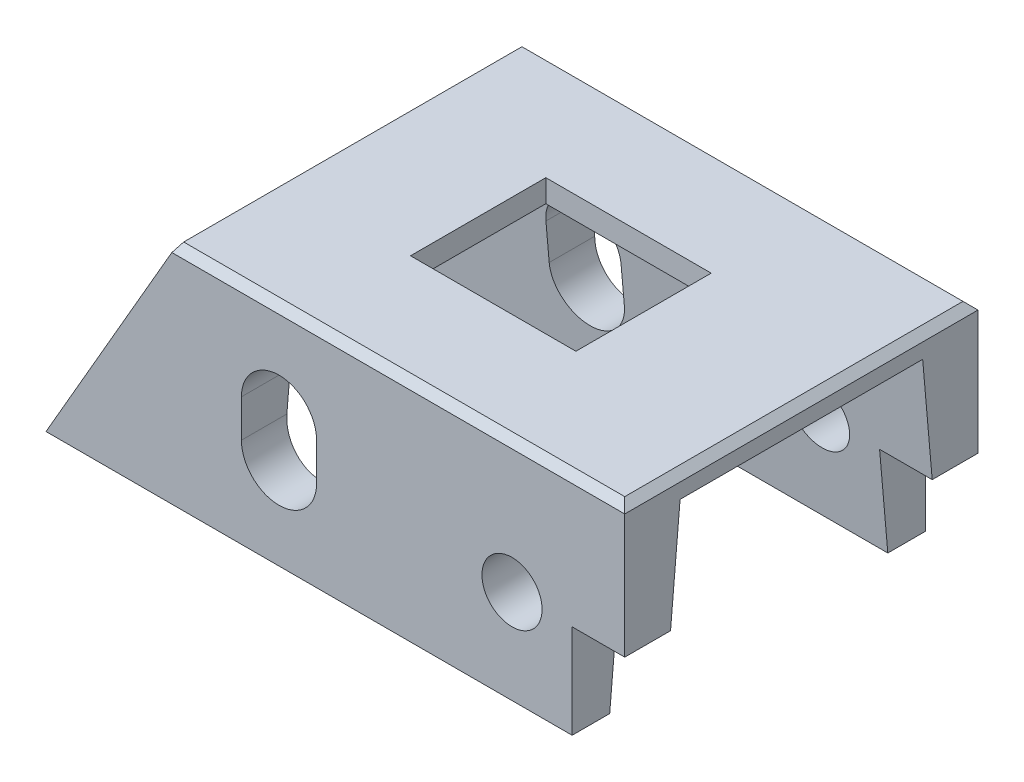
ISO-10303-21;
HEADER;
FILE_DESCRIPTION(('STEP AP214'),'2;1');
FILE_NAME('part.step','',(''),(''),'','','');
FILE_SCHEMA(('AUTOMOTIVE_DESIGN { 1 0 10303 214 1 1 1 1 }'));
ENDSEC;
DATA;
#1=APPLICATION_CONTEXT('core data for automotive mechanical design processes');
#2=APPLICATION_PROTOCOL_DEFINITION('international standard','automotive_design',2000,#1);
#3=PRODUCT_CONTEXT('',#1,'mechanical');
#4=PRODUCT('Part','Part','',(#3));
#5=PRODUCT_RELATED_PRODUCT_CATEGORY('part','',(#4));
#6=PRODUCT_DEFINITION_FORMATION('','',#4);
#7=PRODUCT_DEFINITION_CONTEXT('part definition',#1,'design');
#8=PRODUCT_DEFINITION('design','',#6,#7);
#9=PRODUCT_DEFINITION_SHAPE('','',#8);
#10=(LENGTH_UNIT() NAMED_UNIT(*) SI_UNIT(.MILLI.,.METRE.));
#11=(NAMED_UNIT(*) PLANE_ANGLE_UNIT() SI_UNIT($,.RADIAN.));
#12=(NAMED_UNIT(*) SI_UNIT($,.STERADIAN.) SOLID_ANGLE_UNIT());
#13=UNCERTAINTY_MEASURE_WITH_UNIT(LENGTH_MEASURE(1.E-05),#10,'distance_accuracy_value','');
#14=(GEOMETRIC_REPRESENTATION_CONTEXT(3) GLOBAL_UNCERTAINTY_ASSIGNED_CONTEXT((#13)) GLOBAL_UNIT_ASSIGNED_CONTEXT((#10,
#11,#12)) REPRESENTATION_CONTEXT('',''));
#15=CARTESIAN_POINT('',(0.,0.,0.));
#16=DIRECTION('',(0.,0.,1.));
#17=DIRECTION('',(1.,0.,0.));
#18=AXIS2_PLACEMENT_3D('',#15,#16,#17);
#19=CARTESIAN_POINT('',(-35.,0.,23.5));
#20=DIRECTION('',(0.,1.,0.));
#21=DIRECTION('',(0.,0.,1.));
#22=AXIS2_PLACEMENT_3D('',#19,#20,#21);
#23=PLANE('',#22);
#24=DIRECTION('',(0.,0.,-1.));
#25=VECTOR('',#24,1.);
#26=CARTESIAN_POINT('',(35.,0.,23.5));
#27=LINE('',#26,#25);
#28=CARTESIAN_POINT('',(35.,0.,-18.5));
#29=VERTEX_POINT('',#28);
#30=CARTESIAN_POINT('',(35.,0.,-23.5));
#31=VERTEX_POINT('',#30);
#32=EDGE_CURVE('E388',#29,#31,#27,.T.);
#33=ORIENTED_EDGE('',*,*,#32,.F.);
#34=DIRECTION('',(1.,0.,0.));
#35=VECTOR('',#34,1.);
#36=CARTESIAN_POINT('',(-35.001,0.,-18.5));
#37=LINE('',#36,#35);
#38=CARTESIAN_POINT('',(-35.,0.,-18.5));
#39=VERTEX_POINT('',#38);
#40=EDGE_CURVE('E289',#39,#29,#37,.T.);
#41=ORIENTED_EDGE('',*,*,#40,.F.);
#42=DIRECTION('',(0.,0.,-1.));
#43=VECTOR('',#42,1.);
#44=CARTESIAN_POINT('',(-35.,0.,23.5));
#45=LINE('',#44,#43);
#46=CARTESIAN_POINT('',(-35.,0.,-23.5));
#47=VERTEX_POINT('',#46);
#48=EDGE_CURVE('E392',#39,#47,#45,.T.);
#49=ORIENTED_EDGE('',*,*,#48,.T.);
#50=DIRECTION('',(1.,0.,0.));
#51=VECTOR('',#50,1.);
#52=CARTESIAN_POINT('',(-35.,0.,-23.5));
#53=LINE('',#52,#51);
#54=EDGE_CURVE('E371',#47,#31,#53,.T.);
#55=ORIENTED_EDGE('',*,*,#54,.T.);
#56=EDGE_LOOP('',(#33,#41,#49,#55));
#57=FACE_BOUND('',#56,.T.);
#58=ADVANCED_FACE('F32',(#57),#23,.F.);
#59=CARTESIAN_POINT('',(35.,0.,23.5));
#60=DIRECTION('',(-1.,0.,0.));
#61=DIRECTION('',(0.,0.,1.));
#62=AXIS2_PLACEMENT_3D('',#59,#60,#61);
#63=PLANE('',#62);
#64=DIRECTION('',(0.,0.,-1.));
#65=VECTOR('',#64,1.);
#66=CARTESIAN_POINT('',(35.,12.5,23.5));
#67=LINE('',#66,#65);
#68=CARTESIAN_POINT('',(35.,12.5,-17.4063917059259));
#69=VERTEX_POINT('',#68);
#70=CARTESIAN_POINT('',(35.,12.5,-23.5));
#71=VERTEX_POINT('',#70);
#72=EDGE_CURVE('E384',#69,#71,#67,.T.);
#73=ORIENTED_EDGE('',*,*,#72,.F.);
#74=DIRECTION('',(0.,0.996194698091745,0.0871557427476614));
#75=VECTOR('',#74,1.);
#76=CARTESIAN_POINT('',(35.,0.,-18.5));
#77=LINE('',#76,#75);
#78=EDGE_CURVE('E271',#29,#69,#77,.T.);
#79=ORIENTED_EDGE('',*,*,#78,.F.);
#80=ORIENTED_EDGE('',*,*,#32,.T.);
#81=DIRECTION('',(0.,1.,0.));
#82=VECTOR('',#81,1.);
#83=CARTESIAN_POINT('',(35.,0.,-23.5));
#84=LINE('',#83,#82);
#85=EDGE_CURVE('E374',#31,#71,#84,.T.);
#86=ORIENTED_EDGE('',*,*,#85,.T.);
#87=EDGE_LOOP('',(#73,#79,#80,#86));
#88=FACE_BOUND('',#87,.T.);
#89=ADVANCED_FACE('F479',(#88),#63,.F.);
#90=CARTESIAN_POINT('',(35.,12.5,23.5));
#91=DIRECTION('',(0.,1.,0.));
#92=DIRECTION('',(0.,0.,1.));
#93=AXIS2_PLACEMENT_3D('',#90,#91,#92);
#94=PLANE('',#93);
#95=DIRECTION('',(0.,0.,-1.));
#96=VECTOR('',#95,1.);
#97=CARTESIAN_POINT('',(42.,12.5,23.5));
#98=LINE('',#97,#96);
#99=CARTESIAN_POINT('',(42.,12.5,-17.4063917059259));
#100=VERTEX_POINT('',#99);
#101=CARTESIAN_POINT('',(42.,12.5,-23.5));
#102=VERTEX_POINT('',#101);
#103=EDGE_CURVE('E369',#100,#102,#98,.T.);
#104=ORIENTED_EDGE('',*,*,#103,.F.);
#105=DIRECTION('',(1.,0.,0.));
#106=VECTOR('',#105,1.);
#107=CARTESIAN_POINT('',(-35.001,12.5,-17.4063917059259));
#108=LINE('',#107,#106);
#109=EDGE_CURVE('E253',#69,#100,#108,.T.);
#110=ORIENTED_EDGE('',*,*,#109,.F.);
#111=ORIENTED_EDGE('',*,*,#72,.T.);
#112=DIRECTION('',(1.,0.,0.));
#113=VECTOR('',#112,1.);
#114=CARTESIAN_POINT('',(35.,12.5,-23.5));
#115=LINE('',#114,#113);
#116=EDGE_CURVE('E377',#71,#102,#115,.T.);
#117=ORIENTED_EDGE('',*,*,#116,.T.);
#118=EDGE_LOOP('',(#104,#110,#111,#117));
#119=FACE_BOUND('',#118,.T.);
#120=ADVANCED_FACE('F484',(#119),#94,.F.);
#121=CARTESIAN_POINT('',(-4.,12.,23.5));
#122=DIRECTION('',(0.,0.,-1.));
#123=DIRECTION('',(-1.,0.,0.));
#124=AXIS2_PLACEMENT_3D('',#121,#122,#123);
#125=CYLINDRICAL_SURFACE('',#124,5.);
#126=CARTESIAN_POINT('',(-4.,12.,-17.4501360376889));
#127=DIRECTION('',(0.,0.0871557427476614,-0.996194698091745));
#128=DIRECTION('',(0.,-0.996194698091745,-0.0871557427476614));
#129=AXIS2_PLACEMENT_3D('',#126,#127,#128);
#130=ELLIPSE('',#129,5.01909918771674,5.);
#131=CARTESIAN_POINT('',(-9.00000000000001,12.,-17.4501360376889));
#132=VERTEX_POINT('',#131);
#133=CARTESIAN_POINT('',(0.999999999999996,12.,-17.4501360376889));
#134=VERTEX_POINT('',#133);
#135=EDGE_CURVE('E268',#132,#134,#130,.F.);
#136=ORIENTED_EDGE('',*,*,#135,.T.);
#137=DIRECTION('',(0.,0.,-1.));
#138=VECTOR('',#137,1.);
#139=CARTESIAN_POINT('',(0.999999999999997,12.,23.5));
#140=LINE('',#139,#138);
#141=CARTESIAN_POINT('',(0.999999999999997,12.,-23.5));
#142=VERTEX_POINT('',#141);
#143=EDGE_CURVE('E353',#134,#142,#140,.T.);
#144=ORIENTED_EDGE('',*,*,#143,.T.);
#145=CARTESIAN_POINT('',(-4.,12.,-23.5));
#146=DIRECTION('',(0.,0.,1.));
#147=DIRECTION('',(1.,0.,0.));
#148=AXIS2_PLACEMENT_3D('',#145,#146,#147);
#149=CIRCLE('',#148,5.);
#150=CARTESIAN_POINT('',(-9.00000000000001,12.,-23.5));
#151=VERTEX_POINT('',#150);
#152=EDGE_CURVE('E318',#151,#142,#149,.T.);
#153=ORIENTED_EDGE('',*,*,#152,.F.);
#154=DIRECTION('',(0.,0.,-1.));
#155=VECTOR('',#154,1.);
#156=CARTESIAN_POINT('',(-9.00000000000001,12.,23.5));
#157=LINE('',#156,#155);
#158=EDGE_CURVE('E331',#132,#151,#157,.T.);
#159=ORIENTED_EDGE('',*,*,#158,.F.);
#160=EDGE_LOOP('',(#136,#144,#153,#159));
#161=FACE_BOUND('',#160,.T.);
#162=ADVANCED_FACE('F664',(#161),#125,.F.);
#163=CARTESIAN_POINT('',(0.999999999999997,12.,23.5));
#164=DIRECTION('',(-1.,0.,0.));
#165=DIRECTION('',(0.,0.,1.));
#166=AXIS2_PLACEMENT_3D('',#163,#164,#165);
#167=PLANE('',#166);
#168=DIRECTION('',(0.,0.996194698091745,0.0871557427476614));
#169=VECTOR('',#168,1.);
#170=CARTESIAN_POINT('',(0.999999999999994,0.,-18.5));
#171=LINE('',#170,#169);
#172=CARTESIAN_POINT('',(0.999999999999997,17.,-17.0126927200592));
#173=VERTEX_POINT('',#172);
#174=EDGE_CURVE('E265',#134,#173,#171,.T.);
#175=ORIENTED_EDGE('',*,*,#174,.T.);
#176=DIRECTION('',(0.,0.,-1.));
#177=VECTOR('',#176,1.);
#178=CARTESIAN_POINT('',(0.999999999999997,17.,23.5));
#179=LINE('',#178,#177);
#180=CARTESIAN_POINT('',(0.999999999999997,17.,-23.5));
#181=VERTEX_POINT('',#180);
#182=EDGE_CURVE('E349',#173,#181,#179,.T.);
#183=ORIENTED_EDGE('',*,*,#182,.T.);
#184=DIRECTION('',(0.,1.,0.));
#185=VECTOR('',#184,1.);
#186=CARTESIAN_POINT('',(0.999999999999997,12.,-23.5));
#187=LINE('',#186,#185);
#188=EDGE_CURVE('E334',#142,#181,#187,.T.);
#189=ORIENTED_EDGE('',*,*,#188,.F.);
#190=ORIENTED_EDGE('',*,*,#143,.F.);
#191=EDGE_LOOP('',(#175,#183,#189,#190));
#192=FACE_BOUND('',#191,.T.);
#193=ADVANCED_FACE('F656',(#192),#167,.T.);
#194=CARTESIAN_POINT('',(-4.,17.,23.5));
#195=DIRECTION('',(0.,0.,-1.));
#196=DIRECTION('',(-1.,0.,0.));
#197=AXIS2_PLACEMENT_3D('',#194,#195,#196);
#198=CYLINDRICAL_SURFACE('',#197,5.);
#199=CARTESIAN_POINT('',(-4.,17.,-17.0126927200592));
#200=DIRECTION('',(0.,0.0871557427476614,-0.996194698091745));
#201=DIRECTION('',(0.,-0.996194698091745,-0.0871557427476614));
#202=AXIS2_PLACEMENT_3D('',#199,#200,#201);
#203=ELLIPSE('',#202,5.01909918771674,5.);
#204=CARTESIAN_POINT('',(-9.00000000000001,17.,-17.0126927200592));
#205=VERTEX_POINT('',#204);
#206=EDGE_CURVE('E262',#173,#205,#203,.F.);
#207=ORIENTED_EDGE('',*,*,#206,.T.);
#208=DIRECTION('',(0.,0.,-1.));
#209=VECTOR('',#208,1.);
#210=CARTESIAN_POINT('',(-9.00000000000001,17.,23.5));
#211=LINE('',#210,#209);
#212=CARTESIAN_POINT('',(-9.00000000000001,17.,-23.5));
#213=VERTEX_POINT('',#212);
#214=EDGE_CURVE('E345',#205,#213,#211,.T.);
#215=ORIENTED_EDGE('',*,*,#214,.T.);
#216=CARTESIAN_POINT('',(-4.,17.,-23.5));
#217=DIRECTION('',(0.,0.,1.));
#218=DIRECTION('',(1.,0.,0.));
#219=AXIS2_PLACEMENT_3D('',#216,#217,#218);
#220=CIRCLE('',#219,5.);
#221=EDGE_CURVE('E337',#181,#213,#220,.T.);
#222=ORIENTED_EDGE('',*,*,#221,.F.);
#223=ORIENTED_EDGE('',*,*,#182,.F.);
#224=EDGE_LOOP('',(#207,#215,#222,#223));
#225=FACE_BOUND('',#224,.T.);
#226=ADVANCED_FACE('F646',(#225),#198,.F.);
#227=CARTESIAN_POINT('',(-9.00000000000001,12.,23.5));
#228=DIRECTION('',(1.,0.,0.));
#229=DIRECTION('',(0.,0.,-1.));
#230=AXIS2_PLACEMENT_3D('',#227,#228,#229);
#231=PLANE('',#230);
#232=DIRECTION('',(0.,-0.996194698091745,-0.0871557427476614));
#233=VECTOR('',#232,1.);
#234=CARTESIAN_POINT('',(-9.00000000000001,0.,-18.5));
#235=LINE('',#234,#233);
#236=EDGE_CURVE('E259',#205,#132,#235,.T.);
#237=ORIENTED_EDGE('',*,*,#236,.T.);
#238=ORIENTED_EDGE('',*,*,#158,.T.);
#239=DIRECTION('',(0.,-1.,0.));
#240=VECTOR('',#239,1.);
#241=CARTESIAN_POINT('',(-9.00000000000001,12.,-23.5));
#242=LINE('',#241,#240);
#243=EDGE_CURVE('E324',#213,#151,#242,.T.);
#244=ORIENTED_EDGE('',*,*,#243,.F.);
#245=ORIENTED_EDGE('',*,*,#214,.F.);
#246=EDGE_LOOP('',(#237,#238,#244,#245));
#247=FACE_BOUND('',#246,.T.);
#248=ADVANCED_FACE('F635',(#247),#231,.T.);
#249=CARTESIAN_POINT('',(27.,12.5,23.5));
#250=DIRECTION('',(0.,0.,-1.));
#251=DIRECTION('',(-1.,0.,0.));
#252=AXIS2_PLACEMENT_3D('',#249,#250,#251);
#253=CYLINDRICAL_SURFACE('',#252,4.);
#254=CARTESIAN_POINT('',(27.,12.5,-17.4063917059259));
#255=DIRECTION('',(0.,0.0871557427476614,-0.996194698091745));
#256=DIRECTION('',(0.,-0.996194698091745,-0.0871557427476614));
#257=AXIS2_PLACEMENT_3D('',#254,#255,#256);
#258=ELLIPSE('',#257,4.01527935017339,4.);
#259=CARTESIAN_POINT('',(27.,8.5,-17.7563463600296));
#260=VERTEX_POINT('',#259);
#261=EDGE_CURVE('E256',#260,#260,#258,.F.);
#262=ORIENTED_EDGE('',*,*,#261,.T.);
#263=EDGE_LOOP('',(#262));
#264=FACE_BOUND('',#263,.T.);
#265=CARTESIAN_POINT('',(27.,12.5,-23.5));
#266=DIRECTION('',(0.,0.,1.));
#267=DIRECTION('',(1.,0.,0.));
#268=AXIS2_PLACEMENT_3D('',#265,#266,#267);
#269=CIRCLE('',#268,4.);
#270=CARTESIAN_POINT('',(31.,12.5,-23.5));
#271=VERTEX_POINT('',#270);
#272=EDGE_CURVE('E314',#271,#271,#269,.T.);
#273=ORIENTED_EDGE('',*,*,#272,.F.);
#274=EDGE_LOOP('',(#273));
#275=FACE_BOUND('',#274,.T.);
#276=ADVANCED_FACE('F554',(#264,#275),#253,.F.);
#277=CARTESIAN_POINT('',(0.,0.,23.5));
#278=DIRECTION('',(0.,0.,-1.));
#279=DIRECTION('',(-1.,0.,0.));
#280=AXIS2_PLACEMENT_3D('',#277,#278,#279);
#281=PLANE('',#280);
#282=DIRECTION('',(0.,1.,0.));
#283=VECTOR('',#282,1.);
#284=CARTESIAN_POINT('',(42.,12.5,23.5));
#285=LINE('',#284,#283);
#286=CARTESIAN_POINT('',(42.,12.5,23.5));
#287=VERTEX_POINT('',#286);
#288=CARTESIAN_POINT('',(42.,29.,23.5));
#289=VERTEX_POINT('',#288);
#290=EDGE_CURVE('E367',#287,#289,#285,.T.);
#291=ORIENTED_EDGE('',*,*,#290,.T.);
#292=DIRECTION('',(-1.,0.,0.));
#293=VECTOR('',#292,1.);
#294=CARTESIAN_POINT('',(0.,29.,23.5));
#295=LINE('',#294,#293);
#296=CARTESIAN_POINT('',(-18.2568421935011,29.,23.5));
#297=VERTEX_POINT('',#296);
#298=EDGE_CURVE('E11',#289,#297,#295,.T.);
#299=ORIENTED_EDGE('',*,*,#298,.T.);
#300=DIRECTION('',(-0.499999999999995,-0.866025403784442,0.));
#301=VECTOR('',#300,1.);
#302=CARTESIAN_POINT('',(-17.6794919243115,30.,23.5));
#303=LINE('',#302,#301);
#304=CARTESIAN_POINT('',(-35.,0.,23.5));
#305=VERTEX_POINT('',#304);
#306=EDGE_CURVE('E358',#297,#305,#303,.T.);
#307=ORIENTED_EDGE('',*,*,#306,.T.);
#308=DIRECTION('',(1.,0.,0.));
#309=VECTOR('',#308,1.);
#310=CARTESIAN_POINT('',(-35.,0.,23.5));
#311=LINE('',#310,#309);
#312=CARTESIAN_POINT('',(35.,0.,23.5));
#313=VERTEX_POINT('',#312);
#314=EDGE_CURVE('E360',#305,#313,#311,.T.);
#315=ORIENTED_EDGE('',*,*,#314,.T.);
#316=DIRECTION('',(0.,1.,0.));
#317=VECTOR('',#316,1.);
#318=CARTESIAN_POINT('',(35.,0.,23.5));
#319=LINE('',#318,#317);
#320=CARTESIAN_POINT('',(35.,12.5,23.5));
#321=VERTEX_POINT('',#320);
#322=EDGE_CURVE('E363',#313,#321,#319,.T.);
#323=ORIENTED_EDGE('',*,*,#322,.T.);
#324=DIRECTION('',(1.,0.,0.));
#325=VECTOR('',#324,1.);
#326=CARTESIAN_POINT('',(35.,12.5,23.5));
#327=LINE('',#326,#325);
#328=EDGE_CURVE('E365',#321,#287,#327,.T.);
#329=ORIENTED_EDGE('',*,*,#328,.T.);
#330=EDGE_LOOP('',(#291,#299,#307,#315,#323,#329));
#331=FACE_BOUND('',#330,.T.);
#332=CARTESIAN_POINT('',(-4.,12.,23.5));
#333=DIRECTION('',(0.,0.,1.));
#334=DIRECTION('',(1.,0.,0.));
#335=AXIS2_PLACEMENT_3D('',#332,#333,#334);
#336=CIRCLE('',#335,5.);
#337=CARTESIAN_POINT('',(-9.00000000000001,12.,23.5));
#338=VERTEX_POINT('',#337);
#339=CARTESIAN_POINT('',(0.999999999999997,12.,23.5));
#340=VERTEX_POINT('',#339);
#341=EDGE_CURVE('E321',#338,#340,#336,.T.);
#342=ORIENTED_EDGE('',*,*,#341,.F.);
#343=DIRECTION('',(0.,-1.,0.));
#344=VECTOR('',#343,1.);
#345=CARTESIAN_POINT('',(-9.00000000000001,12.,23.5));
#346=LINE('',#345,#344);
#347=CARTESIAN_POINT('',(-9.00000000000001,17.,23.5));
#348=VERTEX_POINT('',#347);
#349=EDGE_CURVE('E329',#348,#338,#346,.T.);
#350=ORIENTED_EDGE('',*,*,#349,.F.);
#351=CARTESIAN_POINT('',(-4.,17.,23.5));
#352=DIRECTION('',(0.,0.,1.));
#353=DIRECTION('',(1.,0.,0.));
#354=AXIS2_PLACEMENT_3D('',#351,#352,#353);
#355=CIRCLE('',#354,5.);
#356=CARTESIAN_POINT('',(0.999999999999997,17.,23.5));
#357=VERTEX_POINT('',#356);
#358=EDGE_CURVE('E326',#357,#348,#355,.T.);
#359=ORIENTED_EDGE('',*,*,#358,.F.);
#360=DIRECTION('',(0.,1.,0.));
#361=VECTOR('',#360,1.);
#362=CARTESIAN_POINT('',(0.999999999999997,12.,23.5));
#363=LINE('',#362,#361);
#364=EDGE_CURVE('E323',#340,#357,#363,.T.);
#365=ORIENTED_EDGE('',*,*,#364,.F.);
#366=EDGE_LOOP('',(#342,#350,#359,#365));
#367=FACE_BOUND('',#366,.T.);
#368=CARTESIAN_POINT('',(27.,12.5,23.5));
#369=DIRECTION('',(0.,0.,1.));
#370=DIRECTION('',(1.,0.,0.));
#371=AXIS2_PLACEMENT_3D('',#368,#369,#370);
#372=CIRCLE('',#371,4.);
#373=CARTESIAN_POINT('',(31.,12.5,23.5));
#374=VERTEX_POINT('',#373);
#375=EDGE_CURVE('E315',#374,#374,#372,.T.);
#376=ORIENTED_EDGE('',*,*,#375,.F.);
#377=EDGE_LOOP('',(#376));
#378=FACE_BOUND('',#377,.T.);
#379=ADVANCED_FACE('F466',(#331,#367,#378),#281,.F.);
#380=CARTESIAN_POINT('',(0.,0.,-23.5));
#381=DIRECTION('',(0.,0.,-1.));
#382=DIRECTION('',(-1.,0.,0.));
#383=AXIS2_PLACEMENT_3D('',#380,#381,#382);
#384=PLANE('',#383);
#385=ORIENTED_EDGE('',*,*,#243,.T.);
#386=ORIENTED_EDGE('',*,*,#152,.T.);
#387=ORIENTED_EDGE('',*,*,#188,.T.);
#388=ORIENTED_EDGE('',*,*,#221,.T.);
#389=EDGE_LOOP('',(#385,#386,#387,#388));
#390=FACE_BOUND('',#389,.T.);
#391=DIRECTION('',(-0.499999999999995,-0.866025403784442,0.));
#392=VECTOR('',#391,1.);
#393=CARTESIAN_POINT('',(-17.6794919243115,30.,-23.5));
#394=LINE('',#393,#392);
#395=CARTESIAN_POINT('',(-18.2568421935011,29.,-23.5));
#396=VERTEX_POINT('',#395);
#397=EDGE_CURVE('E357',#396,#47,#394,.T.);
#398=ORIENTED_EDGE('',*,*,#397,.F.);
#399=DIRECTION('',(1.,0.,0.));
#400=VECTOR('',#399,1.);
#401=CARTESIAN_POINT('',(42.,29.,-23.5));
#402=LINE('',#401,#400);
#403=CARTESIAN_POINT('',(42.,29.,-23.5));
#404=VERTEX_POINT('',#403);
#405=EDGE_CURVE('E56',#396,#404,#402,.T.);
#406=ORIENTED_EDGE('',*,*,#405,.T.);
#407=DIRECTION('',(0.,1.,0.));
#408=VECTOR('',#407,1.);
#409=CARTESIAN_POINT('',(42.,12.5,-23.5));
#410=LINE('',#409,#408);
#411=EDGE_CURVE('E361',#102,#404,#410,.T.);
#412=ORIENTED_EDGE('',*,*,#411,.F.);
#413=ORIENTED_EDGE('',*,*,#116,.F.);
#414=ORIENTED_EDGE('',*,*,#85,.F.);
#415=ORIENTED_EDGE('',*,*,#54,.F.);
#416=EDGE_LOOP('',(#398,#406,#412,#413,#414,#415));
#417=FACE_BOUND('',#416,.T.);
#418=ORIENTED_EDGE('',*,*,#272,.T.);
#419=EDGE_LOOP('',(#418));
#420=FACE_BOUND('',#419,.T.);
#421=ADVANCED_FACE('F431',(#390,#417,#420),#384,.T.);
#422=CARTESIAN_POINT('',(42.,30.,23.5));
#423=DIRECTION('',(0.,-1.,0.));
#424=DIRECTION('',(1.,0.,0.));
#425=AXIS2_PLACEMENT_3D('',#422,#423,#424);
#426=PLANE('',#425);
#427=DIRECTION('',(-1.,0.,0.));
#428=VECTOR('',#427,1.);
#429=CARTESIAN_POINT('',(-1.00000000000001,30.,-9.));
#430=LINE('',#429,#428);
#431=CARTESIAN_POINT('',(21.,30.,-9.00000000000001));
#432=VERTEX_POINT('',#431);
#433=CARTESIAN_POINT('',(-1.00000000000001,30.,-9.));
#434=VERTEX_POINT('',#433);
#435=EDGE_CURVE('E236',#432,#434,#430,.T.);
#436=ORIENTED_EDGE('',*,*,#435,.F.);
#437=DIRECTION('',(0.,0.,-1.));
#438=VECTOR('',#437,1.);
#439=CARTESIAN_POINT('',(21.,30.,9.));
#440=LINE('',#439,#438);
#441=CARTESIAN_POINT('',(21.,30.,9.));
#442=VERTEX_POINT('',#441);
#443=EDGE_CURVE('E215',#442,#432,#440,.T.);
#444=ORIENTED_EDGE('',*,*,#443,.F.);
#445=DIRECTION('',(1.,0.,0.));
#446=VECTOR('',#445,1.);
#447=CARTESIAN_POINT('',(-1.,30.,9.00000000000001));
#448=LINE('',#447,#446);
#449=CARTESIAN_POINT('',(-1.,30.,9.00000000000001));
#450=VERTEX_POINT('',#449);
#451=EDGE_CURVE('E220',#450,#442,#448,.T.);
#452=ORIENTED_EDGE('',*,*,#451,.F.);
#453=DIRECTION('',(0.,0.,1.));
#454=VECTOR('',#453,1.);
#455=CARTESIAN_POINT('',(-1.,30.,9.00000000000001));
#456=LINE('',#455,#454);
#457=EDGE_CURVE('E243',#434,#450,#456,.T.);
#458=ORIENTED_EDGE('',*,*,#457,.F.);
#459=EDGE_LOOP('',(#436,#444,#452,#458));
#460=FACE_BOUND('',#459,.T.);
#461=DIRECTION('',(0.,0.,-1.));
#462=VECTOR('',#461,1.);
#463=CARTESIAN_POINT('',(41.,30.,23.5));
#464=LINE('',#463,#462);
#465=CARTESIAN_POINT('',(41.,30.,22.5));
#466=VERTEX_POINT('',#465);
#467=CARTESIAN_POINT('',(41.,30.,-22.5));
#468=VERTEX_POINT('',#467);
#469=EDGE_CURVE('E401',#466,#468,#464,.T.);
#470=ORIENTED_EDGE('',*,*,#469,.T.);
#471=DIRECTION('',(-1.,0.,0.));
#472=VECTOR('',#471,1.);
#473=CARTESIAN_POINT('',(-17.6794919243115,30.,-22.5));
#474=LINE('',#473,#472);
#475=CARTESIAN_POINT('',(-17.6794919243115,30.,-22.5));
#476=VERTEX_POINT('',#475);
#477=EDGE_CURVE('E403',#468,#476,#474,.T.);
#478=ORIENTED_EDGE('',*,*,#477,.T.);
#479=DIRECTION('',(0.,0.,-1.));
#480=VECTOR('',#479,1.);
#481=CARTESIAN_POINT('',(-17.6794919243115,30.,23.5));
#482=LINE('',#481,#480);
#483=CARTESIAN_POINT('',(-17.6794919243115,30.,22.5));
#484=VERTEX_POINT('',#483);
#485=EDGE_CURVE('E396',#484,#476,#482,.T.);
#486=ORIENTED_EDGE('',*,*,#485,.F.);
#487=DIRECTION('',(1.,0.,0.));
#488=VECTOR('',#487,1.);
#489=CARTESIAN_POINT('',(42.,30.,22.5));
#490=LINE('',#489,#488);
#491=EDGE_CURVE('E399',#484,#466,#490,.T.);
#492=ORIENTED_EDGE('',*,*,#491,.T.);
#493=EDGE_LOOP('',(#470,#478,#486,#492));
#494=FACE_BOUND('',#493,.T.);
#495=ADVANCED_FACE('F427',(#460,#494),#426,.F.);
#496=CARTESIAN_POINT('',(-17.6794919243115,30.,23.5));
#497=DIRECTION('',(0.866025403784442,-0.499999999999995,0.));
#498=DIRECTION('',(0.499999999999995,0.866025403784442,0.));
#499=AXIS2_PLACEMENT_3D('',#496,#497,#498);
#500=PLANE('',#499);
#501=ORIENTED_EDGE('',*,*,#485,.T.);
#502=DIRECTION('',(-0.37796447300922,-0.654653670707974,-0.654653670707984));
#503=VECTOR('',#502,1.);
#504=CARTESIAN_POINT('',(-9.15385022083873,44.7668445975431,-7.73315540245668));
#505=LINE('',#504,#503);
#506=EDGE_CURVE('E408',#476,#396,#505,.T.);
#507=ORIENTED_EDGE('',*,*,#506,.T.);
#508=ORIENTED_EDGE('',*,*,#397,.T.);
#509=ORIENTED_EDGE('',*,*,#48,.F.);
#510=DIRECTION('',(-0.498570974847153,-0.863550259614426,-0.0755508581011336));
#511=VECTOR('',#510,1.);
#512=CARTESIAN_POINT('',(-35.000248573017,-0.000430541094769145,-18.500037667465));
#513=LINE('',#512,#511);
#514=CARTESIAN_POINT('',(-19.4115427318803,27.,-16.1378060848));
#515=VERTEX_POINT('',#514);
#516=EDGE_CURVE('E276',#515,#39,#513,.T.);
#517=ORIENTED_EDGE('',*,*,#516,.F.);
#518=DIRECTION('',(0.,0.,-1.));
#519=VECTOR('',#518,1.);
#520=CARTESIAN_POINT('',(-19.4115427318803,27.,16.1378060848002));
#521=LINE('',#520,#519);
#522=CARTESIAN_POINT('',(-19.4115427318803,27.,16.1378060848002));
#523=VERTEX_POINT('',#522);
#524=EDGE_CURVE('E273',#523,#515,#521,.T.);
#525=ORIENTED_EDGE('',*,*,#524,.F.);
#526=DIRECTION('',(0.498570974847153,0.863550259614426,-0.0755508581011274));
#527=VECTOR('',#526,1.);
#528=CARTESIAN_POINT('',(-35.000248573017,-0.000430541094768534,18.500037667465));
#529=LINE('',#528,#527);
#530=CARTESIAN_POINT('',(-35.,0.,18.5));
#531=VERTEX_POINT('',#530);
#532=EDGE_CURVE('E311',#531,#523,#529,.T.);
#533=ORIENTED_EDGE('',*,*,#532,.F.);
#534=EDGE_CURVE('E393',#305,#531,#45,.T.);
#535=ORIENTED_EDGE('',*,*,#534,.F.);
#536=ORIENTED_EDGE('',*,*,#306,.F.);
#537=DIRECTION('',(-0.37796447300922,-0.654653670707974,0.654653670707984));
#538=VECTOR('',#537,1.);
#539=CARTESIAN_POINT('',(-15.6487218801439,33.5173968949872,18.9826031050127));
#540=LINE('',#539,#538);
#541=EDGE_CURVE('E406',#297,#484,#540,.F.);
#542=ORIENTED_EDGE('',*,*,#541,.T.);
#543=EDGE_LOOP('',(#501,#507,#508,#509,#517,#525,#533,#535,#536,#542));
#544=FACE_BOUND('',#543,.T.);
#545=ADVANCED_FACE('F430',(#544),#500,.F.);
#546=ORIENTED_EDGE('',*,*,#534,.T.);
#547=DIRECTION('',(1.,0.,0.));
#548=VECTOR('',#547,1.);
#549=CARTESIAN_POINT('',(-35.001,0.,18.5));
#550=LINE('',#549,#548);
#551=CARTESIAN_POINT('',(35.,0.,18.5));
#552=VERTEX_POINT('',#551);
#553=EDGE_CURVE('E291',#531,#552,#550,.T.);
#554=ORIENTED_EDGE('',*,*,#553,.T.);
#555=EDGE_CURVE('E389',#313,#552,#27,.T.);
#556=ORIENTED_EDGE('',*,*,#555,.F.);
#557=ORIENTED_EDGE('',*,*,#314,.F.);
#558=EDGE_LOOP('',(#546,#554,#556,#557));
#559=FACE_BOUND('',#558,.T.);
#560=ADVANCED_FACE('F462',(#559),#23,.F.);
#561=ORIENTED_EDGE('',*,*,#555,.T.);
#562=DIRECTION('',(0.,-0.996194698091746,0.0871557427476543));
#563=VECTOR('',#562,1.);
#564=CARTESIAN_POINT('',(35.,0.,18.5));
#565=LINE('',#564,#563);
#566=CARTESIAN_POINT('',(35.,12.5,17.406391705926));
#567=VERTEX_POINT('',#566);
#568=EDGE_CURVE('E309',#567,#552,#565,.T.);
#569=ORIENTED_EDGE('',*,*,#568,.F.);
#570=EDGE_CURVE('E385',#321,#567,#67,.T.);
#571=ORIENTED_EDGE('',*,*,#570,.F.);
#572=ORIENTED_EDGE('',*,*,#322,.F.);
#573=EDGE_LOOP('',(#561,#569,#571,#572));
#574=FACE_BOUND('',#573,.T.);
#575=ADVANCED_FACE('F487',(#574),#63,.F.);
#576=ORIENTED_EDGE('',*,*,#570,.T.);
#577=DIRECTION('',(-1.,0.,0.));
#578=VECTOR('',#577,1.);
#579=CARTESIAN_POINT('',(-35.001,12.5,17.406391705926));
#580=LINE('',#579,#578);
#581=CARTESIAN_POINT('',(42.,12.5,17.406391705926));
#582=VERTEX_POINT('',#581);
#583=EDGE_CURVE('E228',#582,#567,#580,.T.);
#584=ORIENTED_EDGE('',*,*,#583,.F.);
#585=EDGE_CURVE('E381',#287,#582,#98,.T.);
#586=ORIENTED_EDGE('',*,*,#585,.F.);
#587=ORIENTED_EDGE('',*,*,#328,.F.);
#588=EDGE_LOOP('',(#576,#584,#586,#587));
#589=FACE_BOUND('',#588,.T.);
#590=ADVANCED_FACE('F494',(#589),#94,.F.);
#591=CARTESIAN_POINT('',(42.,12.5,23.5));
#592=DIRECTION('',(-1.,0.,0.));
#593=DIRECTION('',(0.,0.,1.));
#594=AXIS2_PLACEMENT_3D('',#591,#592,#593);
#595=PLANE('',#594);
#596=ORIENTED_EDGE('',*,*,#411,.T.);
#597=DIRECTION('',(0.,0.,1.));
#598=VECTOR('',#597,1.);
#599=CARTESIAN_POINT('',(42.,29.,23.5));
#600=LINE('',#599,#598);
#601=EDGE_CURVE('E41',#404,#289,#600,.T.);
#602=ORIENTED_EDGE('',*,*,#601,.T.);
#603=ORIENTED_EDGE('',*,*,#290,.F.);
#604=ORIENTED_EDGE('',*,*,#585,.T.);
#605=DIRECTION('',(0.,-0.996194698091746,0.0871557427476543));
#606=VECTOR('',#605,1.);
#607=CARTESIAN_POINT('',(42.,0.,18.5));
#608=LINE('',#607,#606);
#609=CARTESIAN_POINT('',(42.,27.,16.1378060848002));
#610=VERTEX_POINT('',#609);
#611=EDGE_CURVE('E280',#610,#582,#608,.T.);
#612=ORIENTED_EDGE('',*,*,#611,.F.);
#613=DIRECTION('',(0.,0.,1.));
#614=VECTOR('',#613,1.);
#615=CARTESIAN_POINT('',(42.,27.,16.1378060848002));
#616=LINE('',#615,#614);
#617=CARTESIAN_POINT('',(42.,27.,-16.1378060848));
#618=VERTEX_POINT('',#617);
#619=EDGE_CURVE('E278',#618,#610,#616,.T.);
#620=ORIENTED_EDGE('',*,*,#619,.F.);
#621=DIRECTION('',(0.,0.996194698091745,0.0871557427476614));
#622=VECTOR('',#621,1.);
#623=CARTESIAN_POINT('',(42.,0.,-18.5));
#624=LINE('',#623,#622);
#625=EDGE_CURVE('E282',#100,#618,#624,.T.);
#626=ORIENTED_EDGE('',*,*,#625,.F.);
#627=ORIENTED_EDGE('',*,*,#103,.T.);
#628=EDGE_LOOP('',(#596,#602,#603,#604,#612,#620,#626,#627));
#629=FACE_BOUND('',#628,.T.);
#630=ADVANCED_FACE('F516',(#629),#595,.F.);
#631=CARTESIAN_POINT('',(-4.,12.,17.450136037689));
#632=DIRECTION('',(0.,0.0871557427476543,0.996194698091746));
#633=DIRECTION('',(0.,0.996194698091746,-0.0871557427476543));
#634=AXIS2_PLACEMENT_3D('',#631,#632,#633);
#635=ELLIPSE('',#634,5.01909918771674,5.);
#636=CARTESIAN_POINT('',(0.999999999999996,12.,17.450136037689));
#637=VERTEX_POINT('',#636);
#638=CARTESIAN_POINT('',(-9.00000000000001,12.,17.450136037689));
#639=VERTEX_POINT('',#638);
#640=EDGE_CURVE('E306',#637,#639,#635,.F.);
#641=ORIENTED_EDGE('',*,*,#640,.T.);
#642=EDGE_CURVE('E342',#338,#639,#157,.T.);
#643=ORIENTED_EDGE('',*,*,#642,.F.);
#644=ORIENTED_EDGE('',*,*,#341,.T.);
#645=EDGE_CURVE('E354',#340,#637,#140,.T.);
#646=ORIENTED_EDGE('',*,*,#645,.T.);
#647=EDGE_LOOP('',(#641,#643,#644,#646));
#648=FACE_BOUND('',#647,.T.);
#649=ADVANCED_FACE('F520',(#648),#125,.F.);
#650=DIRECTION('',(0.,-0.996194698091746,0.0871557427476543));
#651=VECTOR('',#650,1.);
#652=CARTESIAN_POINT('',(0.999999999999994,0.,18.5));
#653=LINE('',#652,#651);
#654=CARTESIAN_POINT('',(0.999999999999997,17.,17.0126927200594));
#655=VERTEX_POINT('',#654);
#656=EDGE_CURVE('E303',#655,#637,#653,.T.);
#657=ORIENTED_EDGE('',*,*,#656,.T.);
#658=ORIENTED_EDGE('',*,*,#645,.F.);
#659=ORIENTED_EDGE('',*,*,#364,.T.);
#660=EDGE_CURVE('E350',#357,#655,#179,.T.);
#661=ORIENTED_EDGE('',*,*,#660,.T.);
#662=EDGE_LOOP('',(#657,#658,#659,#661));
#663=FACE_BOUND('',#662,.T.);
#664=ADVANCED_FACE('F643',(#663),#167,.T.);
#665=CARTESIAN_POINT('',(-4.,17.,17.0126927200594));
#666=DIRECTION('',(0.,0.0871557427476543,0.996194698091746));
#667=DIRECTION('',(0.,0.996194698091746,-0.0871557427476543));
#668=AXIS2_PLACEMENT_3D('',#665,#666,#667);
#669=ELLIPSE('',#668,5.01909918771674,5.);
#670=CARTESIAN_POINT('',(-9.00000000000001,17.,17.0126927200594));
#671=VERTEX_POINT('',#670);
#672=EDGE_CURVE('E300',#671,#655,#669,.F.);
#673=ORIENTED_EDGE('',*,*,#672,.T.);
#674=ORIENTED_EDGE('',*,*,#660,.F.);
#675=ORIENTED_EDGE('',*,*,#358,.T.);
#676=EDGE_CURVE('E346',#348,#671,#211,.T.);
#677=ORIENTED_EDGE('',*,*,#676,.T.);
#678=EDGE_LOOP('',(#673,#674,#675,#677));
#679=FACE_BOUND('',#678,.T.);
#680=ADVANCED_FACE('F632',(#679),#198,.F.);
#681=DIRECTION('',(0.,0.996194698091746,-0.0871557427476543));
#682=VECTOR('',#681,1.);
#683=CARTESIAN_POINT('',(-9.00000000000001,0.,18.5));
#684=LINE('',#683,#682);
#685=EDGE_CURVE('E288',#639,#671,#684,.T.);
#686=ORIENTED_EDGE('',*,*,#685,.T.);
#687=ORIENTED_EDGE('',*,*,#676,.F.);
#688=ORIENTED_EDGE('',*,*,#349,.T.);
#689=ORIENTED_EDGE('',*,*,#642,.T.);
#690=EDGE_LOOP('',(#686,#687,#688,#689));
#691=FACE_BOUND('',#690,.T.);
#692=ADVANCED_FACE('F621',(#691),#231,.T.);
#693=CARTESIAN_POINT('',(27.,12.5,17.406391705926));
#694=DIRECTION('',(0.,0.0871557427476543,0.996194698091746));
#695=DIRECTION('',(0.,0.996194698091746,-0.0871557427476543));
#696=AXIS2_PLACEMENT_3D('',#693,#694,#695);
#697=ELLIPSE('',#696,4.01527935017339,4.);
#698=CARTESIAN_POINT('',(27.,16.5,17.0564370518223));
#699=VERTEX_POINT('',#698);
#700=EDGE_CURVE('E255',#699,#699,#697,.F.);
#701=ORIENTED_EDGE('',*,*,#700,.T.);
#702=EDGE_LOOP('',(#701));
#703=FACE_BOUND('',#702,.T.);
#704=ORIENTED_EDGE('',*,*,#375,.T.);
#705=EDGE_LOOP('',(#704));
#706=FACE_BOUND('',#705,.T.);
#707=ADVANCED_FACE('F595',(#703,#706),#253,.F.);
#708=CARTESIAN_POINT('',(-35.001,27.,16.1378060848002));
#709=DIRECTION('',(0.,1.,0.));
#710=DIRECTION('',(0.,0.,1.));
#711=AXIS2_PLACEMENT_3D('',#708,#709,#710);
#712=PLANE('',#711);
#713=DIRECTION('',(-1.,0.,0.));
#714=VECTOR('',#713,1.);
#715=CARTESIAN_POINT('',(-1.,27.,9.00000000000001));
#716=LINE('',#715,#714);
#717=CARTESIAN_POINT('',(21.,27.,9.));
#718=VERTEX_POINT('',#717);
#719=CARTESIAN_POINT('',(-1.,27.,9.00000000000001));
#720=VERTEX_POINT('',#719);
#721=EDGE_CURVE('E234',#718,#720,#716,.T.);
#722=ORIENTED_EDGE('',*,*,#721,.F.);
#723=DIRECTION('',(0.,0.,1.));
#724=VECTOR('',#723,1.);
#725=CARTESIAN_POINT('',(21.,27.,9.));
#726=LINE('',#725,#724);
#727=CARTESIAN_POINT('',(21.,27.,-9.));
#728=VERTEX_POINT('',#727);
#729=EDGE_CURVE('E212',#728,#718,#726,.T.);
#730=ORIENTED_EDGE('',*,*,#729,.F.);
#731=DIRECTION('',(1.,0.,0.));
#732=VECTOR('',#731,1.);
#733=CARTESIAN_POINT('',(-1.,27.,-9.));
#734=LINE('',#733,#732);
#735=CARTESIAN_POINT('',(-1.00000000000001,27.,-9.));
#736=VERTEX_POINT('',#735);
#737=EDGE_CURVE('E224',#736,#728,#734,.T.);
#738=ORIENTED_EDGE('',*,*,#737,.F.);
#739=DIRECTION('',(0.,0.,-1.));
#740=VECTOR('',#739,1.);
#741=CARTESIAN_POINT('',(-1.,27.,9.));
#742=LINE('',#741,#740);
#743=EDGE_CURVE('E238',#720,#736,#742,.T.);
#744=ORIENTED_EDGE('',*,*,#743,.F.);
#745=EDGE_LOOP('',(#722,#730,#738,#744));
#746=FACE_BOUND('',#745,.T.);
#747=ORIENTED_EDGE('',*,*,#524,.T.);
#748=DIRECTION('',(1.,0.,0.));
#749=VECTOR('',#748,1.);
#750=CARTESIAN_POINT('',(-35.001,27.,-16.1378060848));
#751=LINE('',#750,#749);
#752=EDGE_CURVE('E286',#515,#618,#751,.T.);
#753=ORIENTED_EDGE('',*,*,#752,.T.);
#754=ORIENTED_EDGE('',*,*,#619,.T.);
#755=DIRECTION('',(1.,0.,0.));
#756=VECTOR('',#755,1.);
#757=CARTESIAN_POINT('',(-35.001,27.,16.1378060848002));
#758=LINE('',#757,#756);
#759=EDGE_CURVE('E285',#523,#610,#758,.T.);
#760=ORIENTED_EDGE('',*,*,#759,.F.);
#761=EDGE_LOOP('',(#747,#753,#754,#760));
#762=FACE_BOUND('',#761,.T.);
#763=ADVANCED_FACE('F231',(#746,#762),#712,.F.);
#764=CARTESIAN_POINT('',(-35.001,0.,-18.5));
#765=DIRECTION('',(0.,0.0871557427476614,-0.996194698091745));
#766=DIRECTION('',(0.,0.996194698091745,0.0871557427476614));
#767=AXIS2_PLACEMENT_3D('',#764,#765,#766);
#768=PLANE('',#767);
#769=ORIENTED_EDGE('',*,*,#236,.F.);
#770=ORIENTED_EDGE('',*,*,#206,.F.);
#771=ORIENTED_EDGE('',*,*,#174,.F.);
#772=ORIENTED_EDGE('',*,*,#135,.F.);
#773=EDGE_LOOP('',(#769,#770,#771,#772));
#774=FACE_BOUND('',#773,.T.);
#775=ORIENTED_EDGE('',*,*,#261,.F.);
#776=EDGE_LOOP('',(#775));
#777=FACE_BOUND('',#776,.T.);
#778=ORIENTED_EDGE('',*,*,#516,.T.);
#779=ORIENTED_EDGE('',*,*,#40,.T.);
#780=ORIENTED_EDGE('',*,*,#78,.T.);
#781=ORIENTED_EDGE('',*,*,#109,.T.);
#782=ORIENTED_EDGE('',*,*,#625,.T.);
#783=ORIENTED_EDGE('',*,*,#752,.F.);
#784=EDGE_LOOP('',(#778,#779,#780,#781,#782,#783));
#785=FACE_BOUND('',#784,.T.);
#786=ADVANCED_FACE('F451',(#774,#777,#785),#768,.F.);
#787=CARTESIAN_POINT('',(-35.001,0.,18.5));
#788=DIRECTION('',(0.,0.0871557427476543,0.996194698091746));
#789=DIRECTION('',(0.,-0.996194698091746,0.0871557427476543));
#790=AXIS2_PLACEMENT_3D('',#787,#788,#789);
#791=PLANE('',#790);
#792=ORIENTED_EDGE('',*,*,#656,.F.);
#793=ORIENTED_EDGE('',*,*,#672,.F.);
#794=ORIENTED_EDGE('',*,*,#685,.F.);
#795=ORIENTED_EDGE('',*,*,#640,.F.);
#796=EDGE_LOOP('',(#792,#793,#794,#795));
#797=FACE_BOUND('',#796,.T.);
#798=ORIENTED_EDGE('',*,*,#700,.F.);
#799=EDGE_LOOP('',(#798));
#800=FACE_BOUND('',#799,.T.);
#801=ORIENTED_EDGE('',*,*,#532,.T.);
#802=ORIENTED_EDGE('',*,*,#759,.T.);
#803=ORIENTED_EDGE('',*,*,#611,.T.);
#804=ORIENTED_EDGE('',*,*,#583,.T.);
#805=ORIENTED_EDGE('',*,*,#568,.T.);
#806=ORIENTED_EDGE('',*,*,#553,.F.);
#807=EDGE_LOOP('',(#801,#802,#803,#804,#805,#806));
#808=FACE_BOUND('',#807,.T.);
#809=ADVANCED_FACE('F457',(#797,#800,#808),#791,.F.);
#810=CARTESIAN_POINT('',(21.,-0.001000000000001,9.));
#811=DIRECTION('',(1.,0.,0.));
#812=DIRECTION('',(0.,1.,0.));
#813=AXIS2_PLACEMENT_3D('',#810,#811,#812);
#814=PLANE('',#813);
#815=ORIENTED_EDGE('',*,*,#729,.T.);
#816=DIRECTION('',(0.,1.,0.));
#817=VECTOR('',#816,1.);
#818=CARTESIAN_POINT('',(21.,-0.001000000000001,9.));
#819=LINE('',#818,#817);
#820=EDGE_CURVE('E229',#718,#442,#819,.T.);
#821=ORIENTED_EDGE('',*,*,#820,.T.);
#822=ORIENTED_EDGE('',*,*,#443,.T.);
#823=DIRECTION('',(0.,1.,0.));
#824=VECTOR('',#823,1.);
#825=CARTESIAN_POINT('',(21.,-0.001000000000001,-9.));
#826=LINE('',#825,#824);
#827=EDGE_CURVE('E208',#728,#432,#826,.T.);
#828=ORIENTED_EDGE('',*,*,#827,.F.);
#829=EDGE_LOOP('',(#815,#821,#822,#828));
#830=FACE_BOUND('',#829,.T.);
#831=ADVANCED_FACE('F210',(#830),#814,.F.);
#832=CARTESIAN_POINT('',(-1.,-0.00100000000000447,9.00000000000001));
#833=DIRECTION('',(0.,0.,1.));
#834=DIRECTION('',(1.,0.,0.));
#835=AXIS2_PLACEMENT_3D('',#832,#833,#834);
#836=PLANE('',#835);
#837=ORIENTED_EDGE('',*,*,#721,.T.);
#838=DIRECTION('',(0.,1.,0.));
#839=VECTOR('',#838,1.);
#840=CARTESIAN_POINT('',(-1.,-0.00100000000000447,9.00000000000001));
#841=LINE('',#840,#839);
#842=EDGE_CURVE('E249',#720,#450,#841,.T.);
#843=ORIENTED_EDGE('',*,*,#842,.T.);
#844=ORIENTED_EDGE('',*,*,#451,.T.);
#845=ORIENTED_EDGE('',*,*,#820,.F.);
#846=EDGE_LOOP('',(#837,#843,#844,#845));
#847=FACE_BOUND('',#846,.T.);
#848=ADVANCED_FACE('F425',(#847),#836,.F.);
#849=CARTESIAN_POINT('',(-1.,-0.00100000000000447,9.00000000000001));
#850=DIRECTION('',(-1.,0.,0.));
#851=DIRECTION('',(0.,0.,1.));
#852=AXIS2_PLACEMENT_3D('',#849,#850,#851);
#853=PLANE('',#852);
#854=ORIENTED_EDGE('',*,*,#743,.T.);
#855=DIRECTION('',(0.,1.,0.));
#856=VECTOR('',#855,1.);
#857=CARTESIAN_POINT('',(-1.,-0.00100000000000447,-9.));
#858=LINE('',#857,#856);
#859=EDGE_CURVE('E219',#736,#434,#858,.T.);
#860=ORIENTED_EDGE('',*,*,#859,.T.);
#861=ORIENTED_EDGE('',*,*,#457,.T.);
#862=ORIENTED_EDGE('',*,*,#842,.F.);
#863=EDGE_LOOP('',(#854,#860,#861,#862));
#864=FACE_BOUND('',#863,.T.);
#865=ADVANCED_FACE('F421',(#864),#853,.F.);
#866=CARTESIAN_POINT('',(-1.,-0.00100000000000447,-9.));
#867=DIRECTION('',(0.,0.,-1.));
#868=DIRECTION('',(-1.,0.,0.));
#869=AXIS2_PLACEMENT_3D('',#866,#867,#868);
#870=PLANE('',#869);
#871=ORIENTED_EDGE('',*,*,#737,.T.);
#872=ORIENTED_EDGE('',*,*,#827,.T.);
#873=ORIENTED_EDGE('',*,*,#435,.T.);
#874=ORIENTED_EDGE('',*,*,#859,.F.);
#875=EDGE_LOOP('',(#871,#872,#873,#874));
#876=FACE_BOUND('',#875,.T.);
#877=ADVANCED_FACE('F225',(#876),#870,.F.);
#878=CARTESIAN_POINT('',(0.,29.,23.5));
#879=DIRECTION('',(0.,-0.707106781186553,-0.707106781186542));
#880=DIRECTION('',(-1.,0.,0.));
#881=AXIS2_PLACEMENT_3D('',#878,#879,#880);
#882=PLANE('',#881);
#883=ORIENTED_EDGE('',*,*,#541,.F.);
#884=ORIENTED_EDGE('',*,*,#298,.F.);
#885=DIRECTION('',(-0.577350269189628,0.57735026918962,-0.577350269189629));
#886=VECTOR('',#885,1.);
#887=CARTESIAN_POINT('',(27.9999999999999,42.9999999999999,9.49999999999987));
#888=LINE('',#887,#886);
#889=EDGE_CURVE('E36',#466,#289,#888,.F.);
#890=ORIENTED_EDGE('',*,*,#889,.F.);
#891=ORIENTED_EDGE('',*,*,#491,.F.);
#892=EDGE_LOOP('',(#883,#884,#890,#891));
#893=FACE_BOUND('',#892,.T.);
#894=ADVANCED_FACE('F34',(#893),#882,.F.);
#895=CARTESIAN_POINT('',(41.,30.,23.5));
#896=DIRECTION('',(-0.707106781186543,-0.707106781186552,0.));
#897=DIRECTION('',(0.,0.,-1.));
#898=AXIS2_PLACEMENT_3D('',#895,#896,#897);
#899=PLANE('',#898);
#900=ORIENTED_EDGE('',*,*,#889,.T.);
#901=ORIENTED_EDGE('',*,*,#601,.F.);
#902=DIRECTION('',(0.577350269189628,-0.57735026918962,-0.577350269189629));
#903=VECTOR('',#902,1.);
#904=CARTESIAN_POINT('',(25.6666666666665,45.3333333333333,-7.16666666666649));
#905=LINE('',#904,#903);
#906=EDGE_CURVE('E411',#468,#404,#905,.T.);
#907=ORIENTED_EDGE('',*,*,#906,.F.);
#908=ORIENTED_EDGE('',*,*,#469,.F.);
#909=EDGE_LOOP('',(#900,#901,#907,#908));
#910=FACE_BOUND('',#909,.T.);
#911=ADVANCED_FACE('F435',(#910),#899,.F.);
#912=CARTESIAN_POINT('',(42.,30.,-22.5));
#913=DIRECTION('',(0.,0.707106781186553,-0.707106781186542));
#914=DIRECTION('',(1.,0.,0.));
#915=AXIS2_PLACEMENT_3D('',#912,#913,#914);
#916=PLANE('',#915);
#917=ORIENTED_EDGE('',*,*,#906,.T.);
#918=ORIENTED_EDGE('',*,*,#405,.F.);
#919=ORIENTED_EDGE('',*,*,#506,.F.);
#920=ORIENTED_EDGE('',*,*,#477,.F.);
#921=EDGE_LOOP('',(#917,#918,#919,#920));
#922=FACE_BOUND('',#921,.T.);
#923=ADVANCED_FACE('F436',(#922),#916,.T.);
#924=CLOSED_SHELL('',(#58,#89,#120,#162,#193,#226,#248,#276,#379,#421,#495,#545,#560,#575,#590,
#630,#649,#664,#680,#692,#707,#763,#786,#809,#831,#848,#865,#877,#894,#911,#923));
#925=MANIFOLD_SOLID_BREP('B2',#924);
#926=ADVANCED_BREP_SHAPE_REPRESENTATION('',(#18,#925),#14);
#927=SHAPE_DEFINITION_REPRESENTATION(#9,#926);
ENDSEC;
END-ISO-10303-21;
